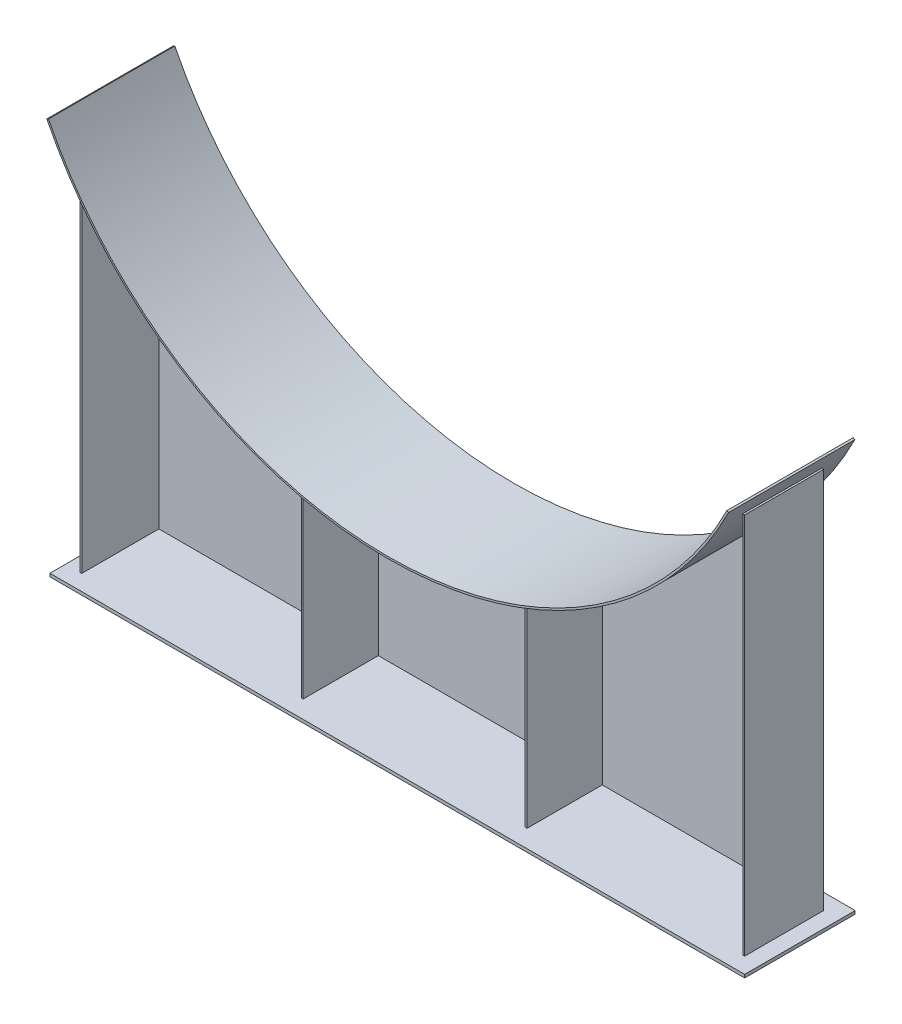
ISO-10303-21;
HEADER;
FILE_DESCRIPTION(('STEP AP214'),'2;1');
FILE_NAME('part.step','',(''),(''),'','','');
FILE_SCHEMA(('AUTOMOTIVE_DESIGN { 1 0 10303 214 1 1 1 1 }'));
ENDSEC;
DATA;
#1=APPLICATION_CONTEXT('core data for automotive mechanical design processes');
#2=APPLICATION_PROTOCOL_DEFINITION('international standard','automotive_design',2000,#1);
#3=PRODUCT_CONTEXT('',#1,'mechanical');
#4=PRODUCT('Part','Part','',(#3));
#5=PRODUCT_RELATED_PRODUCT_CATEGORY('part','',(#4));
#6=PRODUCT_DEFINITION_FORMATION('','',#4);
#7=PRODUCT_DEFINITION_CONTEXT('part definition',#1,'design');
#8=PRODUCT_DEFINITION('design','',#6,#7);
#9=PRODUCT_DEFINITION_SHAPE('','',#8);
#10=(LENGTH_UNIT() NAMED_UNIT(*) SI_UNIT(.MILLI.,.METRE.));
#11=(NAMED_UNIT(*) PLANE_ANGLE_UNIT() SI_UNIT($,.RADIAN.));
#12=(NAMED_UNIT(*) SI_UNIT($,.STERADIAN.) SOLID_ANGLE_UNIT());
#13=UNCERTAINTY_MEASURE_WITH_UNIT(LENGTH_MEASURE(1.E-05),#10,'distance_accuracy_value','');
#14=(GEOMETRIC_REPRESENTATION_CONTEXT(3) GLOBAL_UNCERTAINTY_ASSIGNED_CONTEXT((#13)) GLOBAL_UNIT_ASSIGNED_CONTEXT((#10,
#11,#12)) REPRESENTATION_CONTEXT('',''));
#15=CARTESIAN_POINT('',(0.,0.,0.));
#16=DIRECTION('',(0.,0.,1.));
#17=DIRECTION('',(1.,0.,0.));
#18=AXIS2_PLACEMENT_3D('',#15,#16,#17);
#19=CARTESIAN_POINT('',(1049.5,1807.82069672131,75.));
#20=DIRECTION('',(0.,0.,-1.));
#21=DIRECTION('',(-1.,0.,0.));
#22=AXIS2_PLACEMENT_3D('',#19,#20,#21);
#23=CYLINDRICAL_SURFACE('',#22,1207.82442243414);
#24=CARTESIAN_POINT('',(1049.5,1807.82069672131,-325.));
#25=DIRECTION('',(0.,0.,-1.));
#26=DIRECTION('',(-1.,0.,0.));
#27=AXIS2_PLACEMENT_3D('',#24,#25,#26);
#28=CIRCLE('',#27,1207.82442243414);
#29=CARTESIAN_POINT('',(2128.93340218464,1265.91354076519,-325.));
#30=VERTEX_POINT('',#29);
#31=CARTESIAN_POINT('',(-29.8664933428416,1265.78028450361,-325.));
#32=VERTEX_POINT('',#31);
#33=EDGE_CURVE('E108',#30,#32,#28,.T.);
#34=ORIENTED_EDGE('',*,*,#33,.F.);
#35=DIRECTION('',(0.,0.,-1.));
#36=VECTOR('',#35,1.);
#37=CARTESIAN_POINT('',(2128.93340218464,1265.91354076519,75.));
#38=LINE('',#37,#36);
#39=CARTESIAN_POINT('',(2128.93340218464,1265.91354076519,75.));
#40=VERTEX_POINT('',#39);
#41=EDGE_CURVE('E12',#40,#30,#38,.T.);
#42=ORIENTED_EDGE('',*,*,#41,.F.);
#43=CARTESIAN_POINT('',(1049.5,1807.82069672131,75.));
#44=DIRECTION('',(0.,0.,-1.));
#45=DIRECTION('',(-1.,0.,0.));
#46=AXIS2_PLACEMENT_3D('',#43,#44,#45);
#47=CIRCLE('',#46,1207.82442243414);
#48=CARTESIAN_POINT('',(-29.8664933428416,1265.78028450361,75.));
#49=VERTEX_POINT('',#48);
#50=EDGE_CURVE('E102',#40,#49,#47,.T.);
#51=ORIENTED_EDGE('',*,*,#50,.T.);
#52=DIRECTION('',(0.,0.,-1.));
#53=VECTOR('',#52,1.);
#54=CARTESIAN_POINT('',(-29.8664933428416,1265.78028450361,75.));
#55=LINE('',#54,#53);
#56=EDGE_CURVE('E47',#49,#32,#55,.T.);
#57=ORIENTED_EDGE('',*,*,#56,.T.);
#58=EDGE_LOOP('',(#34,#42,#51,#57));
#59=FACE_BOUND('',#58,.T.);
#60=ADVANCED_FACE('F44',(#59),#23,.T.);
#61=CARTESIAN_POINT('',(2123.57119862855,1268.60552386749,75.));
#62=DIRECTION('',(0.448663850383072,0.893700592681596,0.));
#63=DIRECTION('',(-0.893700592681596,0.448663850383072,0.));
#64=AXIS2_PLACEMENT_3D('',#61,#62,#63);
#65=PLANE('',#64);
#66=DIRECTION('',(0.893700592681596,-0.448663850383072,0.));
#67=VECTOR('',#66,1.);
#68=CARTESIAN_POINT('',(2123.57119862855,1268.60552386749,-325.));
#69=LINE('',#68,#67);
#70=CARTESIAN_POINT('',(2123.57119862855,1268.60552386749,-325.));
#71=VERTEX_POINT('',#70);
#72=EDGE_CURVE('E104',#71,#30,#69,.T.);
#73=ORIENTED_EDGE('',*,*,#72,.F.);
#74=DIRECTION('',(0.,0.,-1.));
#75=VECTOR('',#74,1.);
#76=CARTESIAN_POINT('',(2123.57119862855,1268.60552386749,75.));
#77=LINE('',#76,#75);
#78=CARTESIAN_POINT('',(2123.57119862855,1268.60552386749,75.));
#79=VERTEX_POINT('',#78);
#80=EDGE_CURVE('E53',#79,#71,#77,.T.);
#81=ORIENTED_EDGE('',*,*,#80,.F.);
#82=DIRECTION('',(0.893700592681596,-0.448663850383072,0.));
#83=VECTOR('',#82,1.);
#84=CARTESIAN_POINT('',(2123.57119862855,1268.60552386749,75.));
#85=LINE('',#84,#83);
#86=EDGE_CURVE('E99',#79,#40,#85,.T.);
#87=ORIENTED_EDGE('',*,*,#86,.T.);
#88=ORIENTED_EDGE('',*,*,#41,.T.);
#89=EDGE_LOOP('',(#73,#81,#87,#88));
#90=FACE_BOUND('',#89,.T.);
#91=ADVANCED_FACE('F118',(#90),#65,.T.);
#92=CARTESIAN_POINT('',(1049.5,1807.82069672131,75.));
#93=DIRECTION('',(0.,0.,-1.));
#94=DIRECTION('',(-1.,0.,0.));
#95=AXIS2_PLACEMENT_3D('',#92,#93,#94);
#96=CYLINDRICAL_SURFACE('',#95,1201.82442243414);
#97=CARTESIAN_POINT('',(1049.5,1807.82069672131,-325.));
#98=DIRECTION('',(0.,0.,1.));
#99=DIRECTION('',(-1.,0.,0.));
#100=AXIS2_PLACEMENT_3D('',#97,#98,#99);
#101=CIRCLE('',#100,1201.82442243414);
#102=CARTESIAN_POINT('',(-24.5046221637459,1268.47292957097,-325.));
#103=VERTEX_POINT('',#102);
#104=EDGE_CURVE('E94',#103,#71,#101,.T.);
#105=ORIENTED_EDGE('',*,*,#104,.F.);
#106=DIRECTION('',(0.,0.,-1.));
#107=VECTOR('',#106,1.);
#108=CARTESIAN_POINT('',(-24.5046221637459,1268.47292957097,75.));
#109=LINE('',#108,#107);
#110=CARTESIAN_POINT('',(-24.5046221637459,1268.47292957097,75.));
#111=VERTEX_POINT('',#110);
#112=EDGE_CURVE('E89',#111,#103,#109,.T.);
#113=ORIENTED_EDGE('',*,*,#112,.F.);
#114=CARTESIAN_POINT('',(1049.5,1807.82069672131,75.));
#115=DIRECTION('',(0.,0.,1.));
#116=DIRECTION('',(-1.,0.,0.));
#117=AXIS2_PLACEMENT_3D('',#114,#115,#116);
#118=CIRCLE('',#117,1201.82442243414);
#119=EDGE_CURVE('E92',#111,#79,#118,.T.);
#120=ORIENTED_EDGE('',*,*,#119,.T.);
#121=ORIENTED_EDGE('',*,*,#80,.T.);
#122=EDGE_LOOP('',(#105,#113,#120,#121));
#123=FACE_BOUND('',#122,.T.);
#124=ADVANCED_FACE('F91',(#123),#96,.F.);
#125=CARTESIAN_POINT('',(-29.8664933428416,1265.78028450361,75.));
#126=DIRECTION('',(-0.448774177893579,0.8936451965159,0.));
#127=DIRECTION('',(-0.8936451965159,-0.448774177893579,0.));
#128=AXIS2_PLACEMENT_3D('',#125,#126,#127);
#129=PLANE('',#128);
#130=DIRECTION('',(0.893645196515901,0.448774177893579,0.));
#131=VECTOR('',#130,1.);
#132=CARTESIAN_POINT('',(-29.8664933428416,1265.78028450361,-325.));
#133=LINE('',#132,#131);
#134=EDGE_CURVE('E111',#32,#103,#133,.T.);
#135=ORIENTED_EDGE('',*,*,#134,.F.);
#136=ORIENTED_EDGE('',*,*,#56,.F.);
#137=DIRECTION('',(0.893645196515901,0.448774177893579,0.));
#138=VECTOR('',#137,1.);
#139=CARTESIAN_POINT('',(-29.8664933428416,1265.78028450361,75.));
#140=LINE('',#139,#138);
#141=EDGE_CURVE('E98',#49,#111,#140,.T.);
#142=ORIENTED_EDGE('',*,*,#141,.T.);
#143=ORIENTED_EDGE('',*,*,#112,.T.);
#144=EDGE_LOOP('',(#135,#136,#142,#143));
#145=FACE_BOUND('',#144,.T.);
#146=ADVANCED_FACE('F101',(#145),#129,.T.);
#147=CARTESIAN_POINT('',(1049.5,1807.82069672131,75.));
#148=DIRECTION('',(0.,0.,-1.));
#149=DIRECTION('',(-1.,0.,0.));
#150=AXIS2_PLACEMENT_3D('',#147,#148,#149);
#151=PLANE('',#150);
#152=ORIENTED_EDGE('',*,*,#50,.F.);
#153=ORIENTED_EDGE('',*,*,#86,.F.);
#154=ORIENTED_EDGE('',*,*,#119,.F.);
#155=ORIENTED_EDGE('',*,*,#141,.F.);
#156=EDGE_LOOP('',(#152,#153,#154,#155));
#157=FACE_BOUND('',#156,.T.);
#158=ADVANCED_FACE('F97',(#157),#151,.F.);
#159=CARTESIAN_POINT('',(1049.5,1807.82069672131,-325.));
#160=DIRECTION('',(0.,0.,-1.));
#161=DIRECTION('',(-1.,0.,0.));
#162=AXIS2_PLACEMENT_3D('',#159,#160,#161);
#163=PLANE('',#162);
#164=ORIENTED_EDGE('',*,*,#33,.T.);
#165=ORIENTED_EDGE('',*,*,#134,.T.);
#166=ORIENTED_EDGE('',*,*,#104,.T.);
#167=ORIENTED_EDGE('',*,*,#72,.T.);
#168=EDGE_LOOP('',(#164,#165,#166,#167));
#169=FACE_BOUND('',#168,.T.);
#170=ADVANCED_FACE('F117',(#169),#163,.T.);
#171=CLOSED_SHELL('',(#60,#91,#124,#146,#158,#170));
#172=MANIFOLD_SOLID_BREP('B2',#171);
#173=CARTESIAN_POINT('',(6.,1210.,0.));
#174=DIRECTION('',(0.,0.,-1.));
#175=DIRECTION('',(-1.,0.,0.));
#176=AXIS2_PLACEMENT_3D('',#173,#174,#175);
#177=PLANE('',#176);
#178=DIRECTION('',(0.,-1.,0.));
#179=VECTOR('',#178,1.);
#180=CARTESIAN_POINT('',(6.,1210.,0.));
#181=LINE('',#180,#179);
#182=CARTESIAN_POINT('',(6.00000000000001,1199.58752972994,0.));
#183=VERTEX_POINT('',#182);
#184=CARTESIAN_POINT('',(6.,0.,0.));
#185=VERTEX_POINT('',#184);
#186=EDGE_CURVE('E175',#183,#185,#181,.T.);
#187=ORIENTED_EDGE('',*,*,#186,.F.);
#188=CARTESIAN_POINT('',(1049.5,1807.82069672131,0.));
#189=DIRECTION('',(0.,0.,-1.));
#190=DIRECTION('',(-1.,0.,0.));
#191=AXIS2_PLACEMENT_3D('',#188,#189,#190);
#192=CIRCLE('',#191,1207.82442243414);
#193=CARTESIAN_POINT('',(0.,1210.,0.));
#194=VERTEX_POINT('',#193);
#195=EDGE_CURVE('E345',#183,#194,#192,.T.);
#196=ORIENTED_EDGE('',*,*,#195,.T.);
#197=DIRECTION('',(0.,-1.,0.));
#198=VECTOR('',#197,1.);
#199=CARTESIAN_POINT('',(0.,1210.,0.));
#200=LINE('',#199,#198);
#201=CARTESIAN_POINT('',(0.,0.,0.));
#202=VERTEX_POINT('',#201);
#203=EDGE_CURVE('E390',#194,#202,#200,.T.);
#204=ORIENTED_EDGE('',*,*,#203,.T.);
#205=DIRECTION('',(1.,0.,0.));
#206=VECTOR('',#205,1.);
#207=CARTESIAN_POINT('',(6.,0.,0.));
#208=LINE('',#207,#206);
#209=EDGE_CURVE('E379',#202,#185,#208,.T.);
#210=ORIENTED_EDGE('',*,*,#209,.T.);
#211=EDGE_LOOP('',(#187,#196,#204,#210));
#212=FACE_BOUND('',#211,.T.);
#213=ADVANCED_FACE('F167',(#212),#177,.F.);
#214=CARTESIAN_POINT('',(6.,1210.,0.));
#215=DIRECTION('',(-1.,0.,0.));
#216=DIRECTION('',(0.,0.,1.));
#217=AXIS2_PLACEMENT_3D('',#214,#215,#216);
#218=PLANE('',#217);
#219=DIRECTION('',(0.,-1.,0.));
#220=VECTOR('',#219,1.);
#221=CARTESIAN_POINT('',(6.,1210.,-244.));
#222=LINE('',#221,#220);
#223=CARTESIAN_POINT('',(6.00000000000001,1199.58752972994,-244.));
#224=VERTEX_POINT('',#223);
#225=CARTESIAN_POINT('',(6.,0.,-244.));
#226=VERTEX_POINT('',#225);
#227=EDGE_CURVE('E478',#224,#226,#222,.T.);
#228=ORIENTED_EDGE('',*,*,#227,.F.);
#229=DIRECTION('',(0.,0.,-1.));
#230=VECTOR('',#229,1.);
#231=CARTESIAN_POINT('',(6.00000000000001,1199.58752972994,0.));
#232=LINE('',#231,#230);
#233=EDGE_CURVE('E376',#224,#183,#232,.F.);
#234=ORIENTED_EDGE('',*,*,#233,.T.);
#235=ORIENTED_EDGE('',*,*,#186,.T.);
#236=DIRECTION('',(0.,0.,-1.));
#237=VECTOR('',#236,1.);
#238=CARTESIAN_POINT('',(6.,0.,0.));
#239=LINE('',#238,#237);
#240=EDGE_CURVE('E393',#185,#226,#239,.T.);
#241=ORIENTED_EDGE('',*,*,#240,.T.);
#242=EDGE_LOOP('',(#228,#234,#235,#241));
#243=FACE_BOUND('',#242,.T.);
#244=ADVANCED_FACE('F484',(#243),#218,.F.);
#245=CARTESIAN_POINT('',(6.,1210.,-244.));
#246=DIRECTION('',(0.,0.,-1.));
#247=DIRECTION('',(-1.,0.,0.));
#248=AXIS2_PLACEMENT_3D('',#245,#246,#247);
#249=PLANE('',#248);
#250=DIRECTION('',(0.,-1.,0.));
#251=VECTOR('',#250,1.);
#252=CARTESIAN_POINT('',(695.,1210.,-244.));
#253=LINE('',#252,#251);
#254=CARTESIAN_POINT('',(695.,653.191065441932,-244.));
#255=VERTEX_POINT('',#254);
#256=CARTESIAN_POINT('',(695.,0.,-244.));
#257=VERTEX_POINT('',#256);
#258=EDGE_CURVE('E475',#255,#257,#253,.T.);
#259=ORIENTED_EDGE('',*,*,#258,.F.);
#260=CARTESIAN_POINT('',(1049.5,1807.82069672131,-244.));
#261=DIRECTION('',(0.,0.,-1.));
#262=DIRECTION('',(-1.,0.,0.));
#263=AXIS2_PLACEMENT_3D('',#260,#261,#262);
#264=CIRCLE('',#263,1207.82442243414);
#265=EDGE_CURVE('E373',#255,#224,#264,.T.);
#266=ORIENTED_EDGE('',*,*,#265,.T.);
#267=ORIENTED_EDGE('',*,*,#227,.T.);
#268=DIRECTION('',(1.,0.,0.));
#269=VECTOR('',#268,1.);
#270=CARTESIAN_POINT('',(6.,0.,-244.));
#271=LINE('',#270,#269);
#272=EDGE_CURVE('E396',#226,#257,#271,.T.);
#273=ORIENTED_EDGE('',*,*,#272,.T.);
#274=EDGE_LOOP('',(#259,#266,#267,#273));
#275=FACE_BOUND('',#274,.T.);
#276=ADVANCED_FACE('F535',(#275),#249,.F.);
#277=CARTESIAN_POINT('',(695.,1210.,-244.));
#278=DIRECTION('',(1.,0.,0.));
#279=DIRECTION('',(0.,0.,-1.));
#280=AXIS2_PLACEMENT_3D('',#277,#278,#279);
#281=PLANE('',#280);
#282=DIRECTION('',(0.,-1.,0.));
#283=VECTOR('',#282,1.);
#284=CARTESIAN_POINT('',(695.,1210.,-6.));
#285=LINE('',#284,#283);
#286=CARTESIAN_POINT('',(695.,653.191065441932,-6.));
#287=VERTEX_POINT('',#286);
#288=CARTESIAN_POINT('',(695.,0.,-6.));
#289=VERTEX_POINT('',#288);
#290=EDGE_CURVE('E472',#287,#289,#285,.T.);
#291=ORIENTED_EDGE('',*,*,#290,.F.);
#292=DIRECTION('',(0.,0.,-1.));
#293=VECTOR('',#292,1.);
#294=CARTESIAN_POINT('',(695.,653.191065441932,0.));
#295=LINE('',#294,#293);
#296=EDGE_CURVE('E370',#287,#255,#295,.T.);
#297=ORIENTED_EDGE('',*,*,#296,.T.);
#298=ORIENTED_EDGE('',*,*,#258,.T.);
#299=DIRECTION('',(0.,0.,1.));
#300=VECTOR('',#299,1.);
#301=CARTESIAN_POINT('',(695.,0.,-244.));
#302=LINE('',#301,#300);
#303=EDGE_CURVE('E399',#257,#289,#302,.T.);
#304=ORIENTED_EDGE('',*,*,#303,.T.);
#305=EDGE_LOOP('',(#291,#297,#298,#304));
#306=FACE_BOUND('',#305,.T.);
#307=ADVANCED_FACE('F533',(#306),#281,.F.);
#308=CARTESIAN_POINT('',(695.,1210.,-6.));
#309=DIRECTION('',(0.,0.,-1.));
#310=DIRECTION('',(-1.,0.,0.));
#311=AXIS2_PLACEMENT_3D('',#308,#309,#310);
#312=PLANE('',#311);
#313=DIRECTION('',(0.,-1.,0.));
#314=VECTOR('',#313,1.);
#315=CARTESIAN_POINT('',(701.,1210.,-6.00000000000001));
#316=LINE('',#315,#314);
#317=CARTESIAN_POINT('',(701.,651.365948178008,-6.00000000000001));
#318=VERTEX_POINT('',#317);
#319=CARTESIAN_POINT('',(701.,0.,-6.00000000000001));
#320=VERTEX_POINT('',#319);
#321=EDGE_CURVE('E469',#318,#320,#316,.T.);
#322=ORIENTED_EDGE('',*,*,#321,.F.);
#323=CARTESIAN_POINT('',(1049.5,1807.82069672131,-6.00000000000006));
#324=DIRECTION('',(0.,0.,-1.));
#325=DIRECTION('',(-1.,0.,0.));
#326=AXIS2_PLACEMENT_3D('',#323,#324,#325);
#327=CIRCLE('',#326,1207.82442243414);
#328=EDGE_CURVE('E367',#318,#287,#327,.T.);
#329=ORIENTED_EDGE('',*,*,#328,.T.);
#330=ORIENTED_EDGE('',*,*,#290,.T.);
#331=DIRECTION('',(1.,0.,0.));
#332=VECTOR('',#331,1.);
#333=CARTESIAN_POINT('',(695.,0.,-6.));
#334=LINE('',#333,#332);
#335=EDGE_CURVE('E402',#289,#320,#334,.T.);
#336=ORIENTED_EDGE('',*,*,#335,.T.);
#337=EDGE_LOOP('',(#322,#329,#330,#336));
#338=FACE_BOUND('',#337,.T.);
#339=ADVANCED_FACE('F529',(#338),#312,.F.);
#340=CARTESIAN_POINT('',(701.,1210.,-244.));
#341=DIRECTION('',(-1.,0.,0.));
#342=DIRECTION('',(0.,0.,1.));
#343=AXIS2_PLACEMENT_3D('',#340,#341,#342);
#344=PLANE('',#343);
#345=DIRECTION('',(0.,-1.,0.));
#346=VECTOR('',#345,1.);
#347=CARTESIAN_POINT('',(701.,1210.,-244.));
#348=LINE('',#347,#346);
#349=CARTESIAN_POINT('',(701.,651.365948178008,-244.));
#350=VERTEX_POINT('',#349);
#351=CARTESIAN_POINT('',(701.,0.,-244.));
#352=VERTEX_POINT('',#351);
#353=EDGE_CURVE('E466',#350,#352,#348,.T.);
#354=ORIENTED_EDGE('',*,*,#353,.F.);
#355=DIRECTION('',(0.,0.,-1.));
#356=VECTOR('',#355,1.);
#357=CARTESIAN_POINT('',(701.,651.365948178008,0.));
#358=LINE('',#357,#356);
#359=EDGE_CURVE('E364',#350,#318,#358,.F.);
#360=ORIENTED_EDGE('',*,*,#359,.T.);
#361=ORIENTED_EDGE('',*,*,#321,.T.);
#362=DIRECTION('',(0.,0.,-1.));
#363=VECTOR('',#362,1.);
#364=CARTESIAN_POINT('',(701.,0.,-244.));
#365=LINE('',#364,#363);
#366=EDGE_CURVE('E405',#320,#352,#365,.T.);
#367=ORIENTED_EDGE('',*,*,#366,.T.);
#368=EDGE_LOOP('',(#354,#360,#361,#367));
#369=FACE_BOUND('',#368,.T.);
#370=ADVANCED_FACE('F526',(#369),#344,.F.);
#371=CARTESIAN_POINT('',(1404.,1210.,-244.));
#372=DIRECTION('',(0.,0.,-1.));
#373=DIRECTION('',(-1.,0.,0.));
#374=AXIS2_PLACEMENT_3D('',#371,#372,#373);
#375=PLANE('',#374);
#376=DIRECTION('',(0.,-1.,0.));
#377=VECTOR('',#376,1.);
#378=CARTESIAN_POINT('',(1404.,1210.,-244.));
#379=LINE('',#378,#377);
#380=CARTESIAN_POINT('',(1404.,653.191065441932,-244.));
#381=VERTEX_POINT('',#380);
#382=CARTESIAN_POINT('',(1404.,0.,-244.));
#383=VERTEX_POINT('',#382);
#384=EDGE_CURVE('E463',#381,#383,#379,.T.);
#385=ORIENTED_EDGE('',*,*,#384,.F.);
#386=CARTESIAN_POINT('',(1049.5,1807.82069672131,-244.));
#387=DIRECTION('',(0.,0.,-1.));
#388=DIRECTION('',(-1.,0.,0.));
#389=AXIS2_PLACEMENT_3D('',#386,#387,#388);
#390=CIRCLE('',#389,1207.82442243414);
#391=EDGE_CURVE('E361',#381,#350,#390,.T.);
#392=ORIENTED_EDGE('',*,*,#391,.T.);
#393=ORIENTED_EDGE('',*,*,#353,.T.);
#394=DIRECTION('',(1.,0.,0.));
#395=VECTOR('',#394,1.);
#396=CARTESIAN_POINT('',(1404.,0.,-244.));
#397=LINE('',#396,#395);
#398=EDGE_CURVE('E408',#352,#383,#397,.T.);
#399=ORIENTED_EDGE('',*,*,#398,.T.);
#400=EDGE_LOOP('',(#385,#392,#393,#399));
#401=FACE_BOUND('',#400,.T.);
#402=ADVANCED_FACE('F524',(#401),#375,.F.);
#403=CARTESIAN_POINT('',(1404.,1210.,-244.));
#404=DIRECTION('',(1.,0.,0.));
#405=DIRECTION('',(0.,0.,-1.));
#406=AXIS2_PLACEMENT_3D('',#403,#404,#405);
#407=PLANE('',#406);
#408=DIRECTION('',(0.,-1.,0.));
#409=VECTOR('',#408,1.);
#410=CARTESIAN_POINT('',(1404.,1210.,-6.00000000000009));
#411=LINE('',#410,#409);
#412=CARTESIAN_POINT('',(1404.,653.191065441932,-6.00000000000009));
#413=VERTEX_POINT('',#412);
#414=CARTESIAN_POINT('',(1404.,0.,-6.00000000000009));
#415=VERTEX_POINT('',#414);
#416=EDGE_CURVE('E460',#413,#415,#411,.T.);
#417=ORIENTED_EDGE('',*,*,#416,.F.);
#418=DIRECTION('',(0.,0.,-1.));
#419=VECTOR('',#418,1.);
#420=CARTESIAN_POINT('',(1404.,653.191065441932,0.));
#421=LINE('',#420,#419);
#422=EDGE_CURVE('E358',#413,#381,#421,.T.);
#423=ORIENTED_EDGE('',*,*,#422,.T.);
#424=ORIENTED_EDGE('',*,*,#384,.T.);
#425=DIRECTION('',(0.,0.,1.));
#426=VECTOR('',#425,1.);
#427=CARTESIAN_POINT('',(1404.,0.,-244.));
#428=LINE('',#427,#426);
#429=EDGE_CURVE('E411',#383,#415,#428,.T.);
#430=ORIENTED_EDGE('',*,*,#429,.T.);
#431=EDGE_LOOP('',(#417,#423,#424,#430));
#432=FACE_BOUND('',#431,.T.);
#433=ADVANCED_FACE('F520',(#432),#407,.F.);
#434=CARTESIAN_POINT('',(1410.,1210.,-6.00000000000009));
#435=DIRECTION('',(0.,0.,-1.));
#436=DIRECTION('',(-1.,0.,0.));
#437=AXIS2_PLACEMENT_3D('',#434,#435,#436);
#438=PLANE('',#437);
#439=DIRECTION('',(0.,-1.,0.));
#440=VECTOR('',#439,1.);
#441=CARTESIAN_POINT('',(1410.,1210.,-6.00000000000009));
#442=LINE('',#441,#440);
#443=CARTESIAN_POINT('',(1410.,655.050300923278,-6.00000000000009));
#444=VERTEX_POINT('',#443);
#445=CARTESIAN_POINT('',(1410.,0.,-6.00000000000009));
#446=VERTEX_POINT('',#445);
#447=EDGE_CURVE('E457',#444,#446,#442,.T.);
#448=ORIENTED_EDGE('',*,*,#447,.F.);
#449=CARTESIAN_POINT('',(1049.5,1807.82069672131,-5.99999999999999));
#450=DIRECTION('',(0.,0.,-1.));
#451=DIRECTION('',(-1.,0.,0.));
#452=AXIS2_PLACEMENT_3D('',#449,#450,#451);
#453=CIRCLE('',#452,1207.82442243414);
#454=EDGE_CURVE('E355',#444,#413,#453,.T.);
#455=ORIENTED_EDGE('',*,*,#454,.T.);
#456=ORIENTED_EDGE('',*,*,#416,.T.);
#457=DIRECTION('',(1.,0.,0.));
#458=VECTOR('',#457,1.);
#459=CARTESIAN_POINT('',(1410.,0.,-6.00000000000009));
#460=LINE('',#459,#458);
#461=EDGE_CURVE('E414',#415,#446,#460,.T.);
#462=ORIENTED_EDGE('',*,*,#461,.T.);
#463=EDGE_LOOP('',(#448,#455,#456,#462));
#464=FACE_BOUND('',#463,.T.);
#465=ADVANCED_FACE('F517',(#464),#438,.F.);
#466=CARTESIAN_POINT('',(1410.,1210.,-244.));
#467=DIRECTION('',(-1.,0.,0.));
#468=DIRECTION('',(0.,0.,1.));
#469=AXIS2_PLACEMENT_3D('',#466,#467,#468);
#470=PLANE('',#469);
#471=DIRECTION('',(0.,-1.,0.));
#472=VECTOR('',#471,1.);
#473=CARTESIAN_POINT('',(1410.,1210.,-244.));
#474=LINE('',#473,#472);
#475=CARTESIAN_POINT('',(1410.,655.050300923278,-244.));
#476=VERTEX_POINT('',#475);
#477=CARTESIAN_POINT('',(1410.,0.,-244.));
#478=VERTEX_POINT('',#477);
#479=EDGE_CURVE('E454',#476,#478,#474,.T.);
#480=ORIENTED_EDGE('',*,*,#479,.F.);
#481=DIRECTION('',(0.,0.,-1.));
#482=VECTOR('',#481,1.);
#483=CARTESIAN_POINT('',(1410.,655.050300923278,0.));
#484=LINE('',#483,#482);
#485=EDGE_CURVE('E352',#476,#444,#484,.F.);
#486=ORIENTED_EDGE('',*,*,#485,.T.);
#487=ORIENTED_EDGE('',*,*,#447,.T.);
#488=DIRECTION('',(0.,0.,-1.));
#489=VECTOR('',#488,1.);
#490=CARTESIAN_POINT('',(1410.,0.,-244.));
#491=LINE('',#490,#489);
#492=EDGE_CURVE('E417',#446,#478,#491,.T.);
#493=ORIENTED_EDGE('',*,*,#492,.T.);
#494=EDGE_LOOP('',(#480,#486,#487,#493));
#495=FACE_BOUND('',#494,.T.);
#496=ADVANCED_FACE('F515',(#495),#470,.F.);
#497=CARTESIAN_POINT('',(2099.,1210.,-244.));
#498=DIRECTION('',(0.,0.,-1.));
#499=DIRECTION('',(-1.,0.,0.));
#500=AXIS2_PLACEMENT_3D('',#497,#498,#499);
#501=PLANE('',#500);
#502=DIRECTION('',(0.,-1.,0.));
#503=VECTOR('',#502,1.);
#504=CARTESIAN_POINT('',(2099.,1210.,-244.));
#505=LINE('',#504,#503);
#506=CARTESIAN_POINT('',(2099.,1210.,-244.));
#507=VERTEX_POINT('',#506);
#508=CARTESIAN_POINT('',(2099.,0.,-244.));
#509=VERTEX_POINT('',#508);
#510=EDGE_CURVE('E451',#507,#509,#505,.T.);
#511=ORIENTED_EDGE('',*,*,#510,.F.);
#512=CARTESIAN_POINT('',(1049.5,1807.82069672131,-244.));
#513=DIRECTION('',(0.,0.,-1.));
#514=DIRECTION('',(-1.,0.,0.));
#515=AXIS2_PLACEMENT_3D('',#512,#513,#514);
#516=CIRCLE('',#515,1207.82442243414);
#517=EDGE_CURVE('E348',#507,#476,#516,.T.);
#518=ORIENTED_EDGE('',*,*,#517,.T.);
#519=ORIENTED_EDGE('',*,*,#479,.T.);
#520=DIRECTION('',(1.,0.,0.));
#521=VECTOR('',#520,1.);
#522=CARTESIAN_POINT('',(2099.,0.,-244.));
#523=LINE('',#522,#521);
#524=EDGE_CURVE('E420',#478,#509,#523,.T.);
#525=ORIENTED_EDGE('',*,*,#524,.T.);
#526=EDGE_LOOP('',(#511,#518,#519,#525));
#527=FACE_BOUND('',#526,.T.);
#528=ADVANCED_FACE('F511',(#527),#501,.F.);
#529=CARTESIAN_POINT('',(2099.,1210.,0.));
#530=DIRECTION('',(1.,0.,0.));
#531=DIRECTION('',(0.,0.,-1.));
#532=AXIS2_PLACEMENT_3D('',#529,#530,#531);
#533=PLANE('',#532);
#534=DIRECTION('',(0.,0.,1.));
#535=VECTOR('',#534,1.);
#536=CARTESIAN_POINT('',(2099.,0.,0.));
#537=LINE('',#536,#535);
#538=CARTESIAN_POINT('',(2099.,0.,0.));
#539=VERTEX_POINT('',#538);
#540=EDGE_CURVE('E423',#509,#539,#537,.T.);
#541=ORIENTED_EDGE('',*,*,#540,.T.);
#542=DIRECTION('',(0.,-1.,0.));
#543=VECTOR('',#542,1.);
#544=CARTESIAN_POINT('',(2099.,1210.,0.));
#545=LINE('',#544,#543);
#546=CARTESIAN_POINT('',(2099.,1210.,0.));
#547=VERTEX_POINT('',#546);
#548=EDGE_CURVE('E448',#547,#539,#545,.T.);
#549=ORIENTED_EDGE('',*,*,#548,.F.);
#550=DIRECTION('',(0.,0.,1.));
#551=VECTOR('',#550,1.);
#552=CARTESIAN_POINT('',(2099.,1210.,0.));
#553=LINE('',#552,#551);
#554=EDGE_CURVE('E380',#507,#547,#553,.T.);
#555=ORIENTED_EDGE('',*,*,#554,.F.);
#556=ORIENTED_EDGE('',*,*,#510,.T.);
#557=EDGE_LOOP('',(#541,#549,#555,#556));
#558=FACE_BOUND('',#557,.T.);
#559=ADVANCED_FACE('F507',(#558),#533,.F.);
#560=CARTESIAN_POINT('',(2105.,1210.,0.));
#561=DIRECTION('',(0.,0.,-1.));
#562=DIRECTION('',(-1.,0.,0.));
#563=AXIS2_PLACEMENT_3D('',#560,#561,#562);
#564=PLANE('',#563);
#565=DIRECTION('',(1.,0.,0.));
#566=VECTOR('',#565,1.);
#567=CARTESIAN_POINT('',(2105.,0.,0.));
#568=LINE('',#567,#566);
#569=CARTESIAN_POINT('',(2105.,0.,0.));
#570=VERTEX_POINT('',#569);
#571=EDGE_CURVE('E426',#539,#570,#568,.T.);
#572=ORIENTED_EDGE('',*,*,#571,.T.);
#573=DIRECTION('',(0.,-1.,0.));
#574=VECTOR('',#573,1.);
#575=CARTESIAN_POINT('',(2105.,1210.,0.));
#576=LINE('',#575,#574);
#577=CARTESIAN_POINT('',(2105.,1210.,0.));
#578=VERTEX_POINT('',#577);
#579=EDGE_CURVE('E445',#578,#570,#576,.T.);
#580=ORIENTED_EDGE('',*,*,#579,.F.);
#581=DIRECTION('',(1.,0.,0.));
#582=VECTOR('',#581,1.);
#583=CARTESIAN_POINT('',(2105.,1210.,0.));
#584=LINE('',#583,#582);
#585=EDGE_CURVE('E382',#547,#578,#584,.T.);
#586=ORIENTED_EDGE('',*,*,#585,.F.);
#587=ORIENTED_EDGE('',*,*,#548,.T.);
#588=EDGE_LOOP('',(#572,#580,#586,#587));
#589=FACE_BOUND('',#588,.T.);
#590=ADVANCED_FACE('F504',(#589),#564,.F.);
#591=CARTESIAN_POINT('',(2105.,1210.,0.));
#592=DIRECTION('',(-1.,0.,0.));
#593=DIRECTION('',(0.,0.,1.));
#594=AXIS2_PLACEMENT_3D('',#591,#592,#593);
#595=PLANE('',#594);
#596=DIRECTION('',(0.,0.,-1.));
#597=VECTOR('',#596,1.);
#598=CARTESIAN_POINT('',(2105.,0.,0.));
#599=LINE('',#598,#597);
#600=CARTESIAN_POINT('',(2105.,0.,-250.));
#601=VERTEX_POINT('',#600);
#602=EDGE_CURVE('E429',#570,#601,#599,.T.);
#603=ORIENTED_EDGE('',*,*,#602,.T.);
#604=DIRECTION('',(0.,-1.,0.));
#605=VECTOR('',#604,1.);
#606=CARTESIAN_POINT('',(2105.,1210.,-250.));
#607=LINE('',#606,#605);
#608=CARTESIAN_POINT('',(2105.,1210.,-250.));
#609=VERTEX_POINT('',#608);
#610=EDGE_CURVE('E442',#609,#601,#607,.T.);
#611=ORIENTED_EDGE('',*,*,#610,.F.);
#612=DIRECTION('',(0.,0.,-1.));
#613=VECTOR('',#612,1.);
#614=CARTESIAN_POINT('',(2105.,1210.,0.));
#615=LINE('',#614,#613);
#616=EDGE_CURVE('E182',#578,#609,#615,.T.);
#617=ORIENTED_EDGE('',*,*,#616,.F.);
#618=ORIENTED_EDGE('',*,*,#579,.T.);
#619=EDGE_LOOP('',(#603,#611,#617,#618));
#620=FACE_BOUND('',#619,.T.);
#621=ADVANCED_FACE('F500',(#620),#595,.F.);
#622=CARTESIAN_POINT('',(0.,1210.,-250.));
#623=DIRECTION('',(0.,0.,1.));
#624=DIRECTION('',(1.,0.,0.));
#625=AXIS2_PLACEMENT_3D('',#622,#623,#624);
#626=PLANE('',#625);
#627=DIRECTION('',(0.,-1.,0.));
#628=VECTOR('',#627,1.);
#629=CARTESIAN_POINT('',(0.,1210.,-250.));
#630=LINE('',#629,#628);
#631=CARTESIAN_POINT('',(0.,1210.,-250.));
#632=VERTEX_POINT('',#631);
#633=CARTESIAN_POINT('',(0.,0.,-250.));
#634=VERTEX_POINT('',#633);
#635=EDGE_CURVE('E439',#632,#634,#630,.T.);
#636=ORIENTED_EDGE('',*,*,#635,.F.);
#637=CARTESIAN_POINT('',(1049.5,1807.82069672131,-250.));
#638=DIRECTION('',(0.,0.,-1.));
#639=DIRECTION('',(-1.,0.,0.));
#640=AXIS2_PLACEMENT_3D('',#637,#638,#639);
#641=CIRCLE('',#640,1207.82442243414);
#642=CARTESIAN_POINT('',(2099.,1210.,-250.));
#643=VERTEX_POINT('',#642);
#644=EDGE_CURVE('E341',#643,#632,#641,.T.);
#645=ORIENTED_EDGE('',*,*,#644,.F.);
#646=DIRECTION('',(-1.,0.,0.));
#647=VECTOR('',#646,1.);
#648=CARTESIAN_POINT('',(2105.,1210.,-250.));
#649=LINE('',#648,#647);
#650=EDGE_CURVE('E386',#609,#643,#649,.T.);
#651=ORIENTED_EDGE('',*,*,#650,.F.);
#652=ORIENTED_EDGE('',*,*,#610,.T.);
#653=DIRECTION('',(-1.,0.,0.));
#654=VECTOR('',#653,1.);
#655=CARTESIAN_POINT('',(0.,0.,-250.));
#656=LINE('',#655,#654);
#657=EDGE_CURVE('E432',#601,#634,#656,.T.);
#658=ORIENTED_EDGE('',*,*,#657,.T.);
#659=EDGE_LOOP('',(#636,#645,#651,#652,#658));
#660=FACE_BOUND('',#659,.T.);
#661=ADVANCED_FACE('F497',(#660),#626,.F.);
#662=CARTESIAN_POINT('',(0.,1210.,0.));
#663=DIRECTION('',(1.,0.,0.));
#664=DIRECTION('',(0.,0.,-1.));
#665=AXIS2_PLACEMENT_3D('',#662,#663,#664);
#666=PLANE('',#665);
#667=DIRECTION('',(0.,0.,1.));
#668=VECTOR('',#667,1.);
#669=CARTESIAN_POINT('',(0.,0.,0.));
#670=LINE('',#669,#668);
#671=EDGE_CURVE('E383',#634,#202,#670,.T.);
#672=ORIENTED_EDGE('',*,*,#671,.T.);
#673=ORIENTED_EDGE('',*,*,#203,.F.);
#674=DIRECTION('',(0.,0.,1.));
#675=VECTOR('',#674,1.);
#676=CARTESIAN_POINT('',(0.,1210.,0.));
#677=LINE('',#676,#675);
#678=EDGE_CURVE('E388',#632,#194,#677,.T.);
#679=ORIENTED_EDGE('',*,*,#678,.F.);
#680=ORIENTED_EDGE('',*,*,#635,.T.);
#681=EDGE_LOOP('',(#672,#673,#679,#680));
#682=FACE_BOUND('',#681,.T.);
#683=ADVANCED_FACE('F492',(#682),#666,.F.);
#684=CARTESIAN_POINT('',(0.,1210.,0.));
#685=DIRECTION('',(0.,-1.,0.));
#686=DIRECTION('',(0.,0.,-1.));
#687=AXIS2_PLACEMENT_3D('',#684,#685,#686);
#688=PLANE('',#687);
#689=ORIENTED_EDGE('',*,*,#650,.T.);
#690=DIRECTION('',(0.,0.,-1.));
#691=VECTOR('',#690,1.);
#692=CARTESIAN_POINT('',(2099.,1210.,0.));
#693=LINE('',#692,#691);
#694=EDGE_CURVE('E42',#643,#507,#693,.F.);
#695=ORIENTED_EDGE('',*,*,#694,.T.);
#696=ORIENTED_EDGE('',*,*,#554,.T.);
#697=ORIENTED_EDGE('',*,*,#585,.T.);
#698=ORIENTED_EDGE('',*,*,#616,.T.);
#699=EDGE_LOOP('',(#689,#695,#696,#697,#698));
#700=FACE_BOUND('',#699,.T.);
#701=ADVANCED_FACE('F538',(#700),#688,.F.);
#702=CARTESIAN_POINT('',(1049.5,1807.82069672131,0.));
#703=DIRECTION('',(0.,0.,-1.));
#704=DIRECTION('',(-1.,0.,0.));
#705=AXIS2_PLACEMENT_3D('',#702,#703,#704);
#706=CYLINDRICAL_SURFACE('',#705,1207.82442243414);
#707=ORIENTED_EDGE('',*,*,#265,.F.);
#708=ORIENTED_EDGE('',*,*,#296,.F.);
#709=ORIENTED_EDGE('',*,*,#328,.F.);
#710=ORIENTED_EDGE('',*,*,#359,.F.);
#711=ORIENTED_EDGE('',*,*,#391,.F.);
#712=ORIENTED_EDGE('',*,*,#422,.F.);
#713=ORIENTED_EDGE('',*,*,#454,.F.);
#714=ORIENTED_EDGE('',*,*,#485,.F.);
#715=ORIENTED_EDGE('',*,*,#517,.F.);
#716=ORIENTED_EDGE('',*,*,#694,.F.);
#717=ORIENTED_EDGE('',*,*,#644,.T.);
#718=ORIENTED_EDGE('',*,*,#678,.T.);
#719=ORIENTED_EDGE('',*,*,#195,.F.);
#720=ORIENTED_EDGE('',*,*,#233,.F.);
#721=EDGE_LOOP('',(#707,#708,#709,#710,#711,#712,#713,#714,#715,#716,#717,#718,#719,#720));
#722=FACE_BOUND('',#721,.T.);
#723=ADVANCED_FACE('F537',(#722),#706,.F.);
#724=CARTESIAN_POINT('',(2155.,-10.,-300.));
#725=DIRECTION('',(1.,0.,0.));
#726=DIRECTION('',(0.,0.,-1.));
#727=AXIS2_PLACEMENT_3D('',#724,#725,#726);
#728=PLANE('',#727);
#729=DIRECTION('',(0.,0.,-1.));
#730=VECTOR('',#729,1.);
#731=CARTESIAN_POINT('',(2155.,0.,-300.));
#732=LINE('',#731,#730);
#733=CARTESIAN_POINT('',(2155.,0.,50.));
#734=VERTEX_POINT('',#733);
#735=CARTESIAN_POINT('',(2155.,0.,-300.));
#736=VERTEX_POINT('',#735);
#737=EDGE_CURVE('E335',#734,#736,#732,.T.);
#738=ORIENTED_EDGE('',*,*,#737,.F.);
#739=DIRECTION('',(0.,1.,0.));
#740=VECTOR('',#739,1.);
#741=CARTESIAN_POINT('',(2155.,-10.,50.));
#742=LINE('',#741,#740);
#743=CARTESIAN_POINT('',(2155.,-10.,50.));
#744=VERTEX_POINT('',#743);
#745=EDGE_CURVE('E326',#744,#734,#742,.T.);
#746=ORIENTED_EDGE('',*,*,#745,.F.);
#747=DIRECTION('',(0.,0.,-1.));
#748=VECTOR('',#747,1.);
#749=CARTESIAN_POINT('',(2155.,-10.,-300.));
#750=LINE('',#749,#748);
#751=CARTESIAN_POINT('',(2155.,-10.,-300.));
#752=VERTEX_POINT('',#751);
#753=EDGE_CURVE('E320',#744,#752,#750,.T.);
#754=ORIENTED_EDGE('',*,*,#753,.T.);
#755=DIRECTION('',(0.,1.,0.));
#756=VECTOR('',#755,1.);
#757=CARTESIAN_POINT('',(2155.,-10.,-300.));
#758=LINE('',#757,#756);
#759=EDGE_CURVE('E302',#752,#736,#758,.T.);
#760=ORIENTED_EDGE('',*,*,#759,.T.);
#761=EDGE_LOOP('',(#738,#746,#754,#760));
#762=FACE_BOUND('',#761,.T.);
#763=ADVANCED_FACE('F325',(#762),#728,.T.);
#764=CARTESIAN_POINT('',(2155.,-10.,50.));
#765=DIRECTION('',(0.,0.,1.));
#766=DIRECTION('',(1.,0.,0.));
#767=AXIS2_PLACEMENT_3D('',#764,#765,#766);
#768=PLANE('',#767);
#769=DIRECTION('',(1.,0.,0.));
#770=VECTOR('',#769,1.);
#771=CARTESIAN_POINT('',(2155.,0.,50.));
#772=LINE('',#771,#770);
#773=CARTESIAN_POINT('',(-44.9999999999999,0.,50.0000000000003));
#774=VERTEX_POINT('',#773);
#775=EDGE_CURVE('E327',#774,#734,#772,.T.);
#776=ORIENTED_EDGE('',*,*,#775,.F.);
#777=DIRECTION('',(0.,1.,0.));
#778=VECTOR('',#777,1.);
#779=CARTESIAN_POINT('',(-44.9999999999999,-10.,50.0000000000003));
#780=LINE('',#779,#778);
#781=CARTESIAN_POINT('',(-44.9999999999999,-10.,50.0000000000003));
#782=VERTEX_POINT('',#781);
#783=EDGE_CURVE('E342',#782,#774,#780,.T.);
#784=ORIENTED_EDGE('',*,*,#783,.F.);
#785=DIRECTION('',(1.,0.,0.));
#786=VECTOR('',#785,1.);
#787=CARTESIAN_POINT('',(2155.,-10.,50.));
#788=LINE('',#787,#786);
#789=EDGE_CURVE('E313',#782,#744,#788,.T.);
#790=ORIENTED_EDGE('',*,*,#789,.T.);
#791=ORIENTED_EDGE('',*,*,#745,.T.);
#792=EDGE_LOOP('',(#776,#784,#790,#791));
#793=FACE_BOUND('',#792,.T.);
#794=ADVANCED_FACE('F597',(#793),#768,.T.);
#795=CARTESIAN_POINT('',(-44.9999999999999,-10.,-300.));
#796=DIRECTION('',(-1.,0.,0.));
#797=DIRECTION('',(0.,0.,1.));
#798=AXIS2_PLACEMENT_3D('',#795,#796,#797);
#799=PLANE('',#798);
#800=DIRECTION('',(0.,0.,1.));
#801=VECTOR('',#800,1.);
#802=CARTESIAN_POINT('',(-44.9999999999999,0.,-300.));
#803=LINE('',#802,#801);
#804=CARTESIAN_POINT('',(-44.9999999999999,0.,-300.));
#805=VERTEX_POINT('',#804);
#806=EDGE_CURVE('E330',#805,#774,#803,.T.);
#807=ORIENTED_EDGE('',*,*,#806,.F.);
#808=DIRECTION('',(0.,1.,0.));
#809=VECTOR('',#808,1.);
#810=CARTESIAN_POINT('',(-44.9999999999999,-10.,-300.));
#811=LINE('',#810,#809);
#812=CARTESIAN_POINT('',(-44.9999999999999,-10.,-300.));
#813=VERTEX_POINT('',#812);
#814=EDGE_CURVE('E312',#813,#805,#811,.T.);
#815=ORIENTED_EDGE('',*,*,#814,.F.);
#816=DIRECTION('',(0.,0.,1.));
#817=VECTOR('',#816,1.);
#818=CARTESIAN_POINT('',(-44.9999999999999,-10.,-300.));
#819=LINE('',#818,#817);
#820=EDGE_CURVE('E323',#813,#782,#819,.T.);
#821=ORIENTED_EDGE('',*,*,#820,.T.);
#822=ORIENTED_EDGE('',*,*,#783,.T.);
#823=EDGE_LOOP('',(#807,#815,#821,#822));
#824=FACE_BOUND('',#823,.T.);
#825=ADVANCED_FACE('F607',(#824),#799,.T.);
#826=CARTESIAN_POINT('',(2155.,-10.,-300.));
#827=DIRECTION('',(0.,0.,-1.));
#828=DIRECTION('',(-1.,0.,0.));
#829=AXIS2_PLACEMENT_3D('',#826,#827,#828);
#830=PLANE('',#829);
#831=DIRECTION('',(-1.,0.,0.));
#832=VECTOR('',#831,1.);
#833=CARTESIAN_POINT('',(2155.,0.,-300.));
#834=LINE('',#833,#832);
#835=EDGE_CURVE('E307',#736,#805,#834,.T.);
#836=ORIENTED_EDGE('',*,*,#835,.F.);
#837=ORIENTED_EDGE('',*,*,#759,.F.);
#838=DIRECTION('',(-1.,0.,0.));
#839=VECTOR('',#838,1.);
#840=CARTESIAN_POINT('',(2155.,-10.,-300.));
#841=LINE('',#840,#839);
#842=EDGE_CURVE('E305',#752,#813,#841,.T.);
#843=ORIENTED_EDGE('',*,*,#842,.T.);
#844=ORIENTED_EDGE('',*,*,#814,.T.);
#845=EDGE_LOOP('',(#836,#837,#843,#844));
#846=FACE_BOUND('',#845,.T.);
#847=ADVANCED_FACE('F304',(#846),#830,.T.);
#848=CARTESIAN_POINT('',(0.,-10.,0.));
#849=DIRECTION('',(0.,-1.,0.));
#850=DIRECTION('',(0.,0.,-1.));
#851=AXIS2_PLACEMENT_3D('',#848,#849,#850);
#852=PLANE('',#851);
#853=ORIENTED_EDGE('',*,*,#753,.F.);
#854=ORIENTED_EDGE('',*,*,#789,.F.);
#855=ORIENTED_EDGE('',*,*,#820,.F.);
#856=ORIENTED_EDGE('',*,*,#842,.F.);
#857=EDGE_LOOP('',(#853,#854,#855,#856));
#858=FACE_BOUND('',#857,.T.);
#859=ADVANCED_FACE('F318',(#858),#852,.T.);
#860=CARTESIAN_POINT('',(0.,0.,0.));
#861=DIRECTION('',(0.,-1.,0.));
#862=DIRECTION('',(0.,0.,-1.));
#863=AXIS2_PLACEMENT_3D('',#860,#861,#862);
#864=PLANE('',#863);
#865=ORIENTED_EDGE('',*,*,#209,.F.);
#866=ORIENTED_EDGE('',*,*,#671,.F.);
#867=ORIENTED_EDGE('',*,*,#657,.F.);
#868=ORIENTED_EDGE('',*,*,#602,.F.);
#869=ORIENTED_EDGE('',*,*,#571,.F.);
#870=ORIENTED_EDGE('',*,*,#540,.F.);
#871=ORIENTED_EDGE('',*,*,#524,.F.);
#872=ORIENTED_EDGE('',*,*,#492,.F.);
#873=ORIENTED_EDGE('',*,*,#461,.F.);
#874=ORIENTED_EDGE('',*,*,#429,.F.);
#875=ORIENTED_EDGE('',*,*,#398,.F.);
#876=ORIENTED_EDGE('',*,*,#366,.F.);
#877=ORIENTED_EDGE('',*,*,#335,.F.);
#878=ORIENTED_EDGE('',*,*,#303,.F.);
#879=ORIENTED_EDGE('',*,*,#272,.F.);
#880=ORIENTED_EDGE('',*,*,#240,.F.);
#881=EDGE_LOOP('',(#865,#866,#867,#868,#869,#870,#871,#872,#873,#874,#875,#876,#877,#878,#879,#880));
#882=FACE_BOUND('',#881,.T.);
#883=ORIENTED_EDGE('',*,*,#737,.T.);
#884=ORIENTED_EDGE('',*,*,#835,.T.);
#885=ORIENTED_EDGE('',*,*,#806,.T.);
#886=ORIENTED_EDGE('',*,*,#775,.T.);
#887=EDGE_LOOP('',(#883,#884,#885,#886));
#888=FACE_BOUND('',#887,.T.);
#889=ADVANCED_FACE('F488',(#882,#888),#864,.F.);
#890=CLOSED_SHELL('',(#213,#244,#276,#307,#339,#370,#402,#433,#465,#496,#528,#559,#590,#621,
#661,#683,#701,#723,#763,#794,#825,#847,#859,#889));
#891=MANIFOLD_SOLID_BREP('B6',#890);
#892=ADVANCED_BREP_SHAPE_REPRESENTATION('',(#18,#172,#891),#14);
#893=SHAPE_DEFINITION_REPRESENTATION(#9,#892);
ENDSEC;
END-ISO-10303-21;
